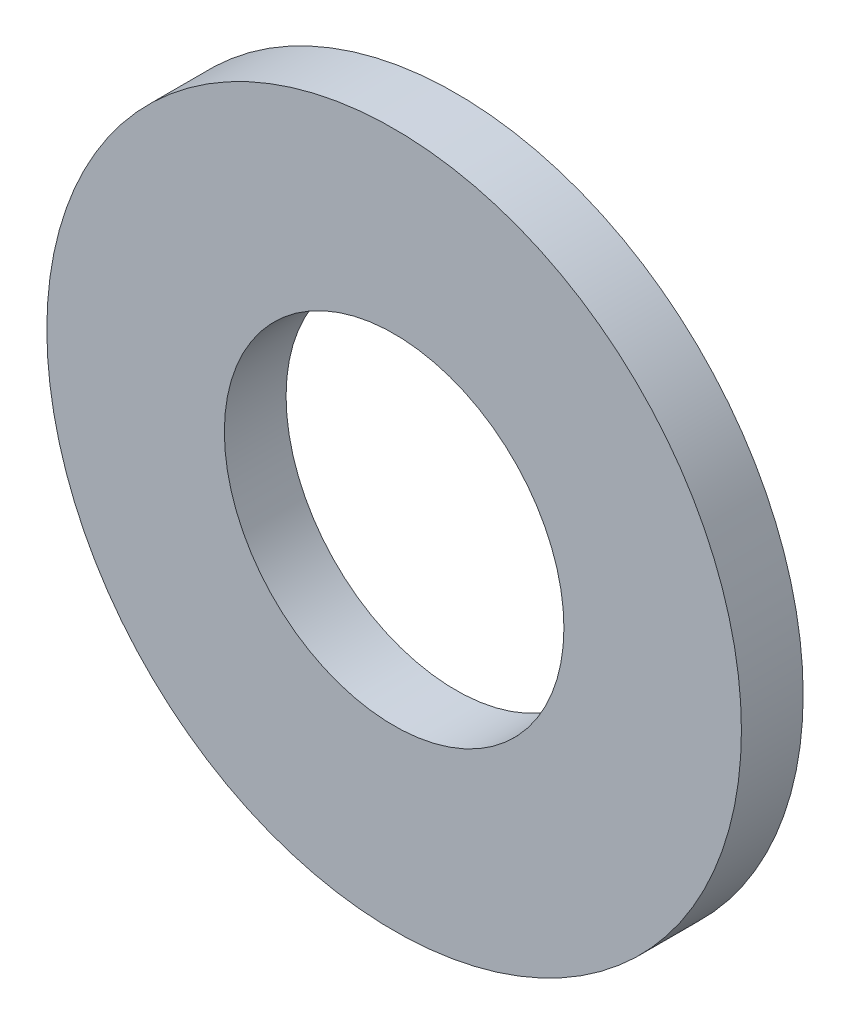
ISO-10303-21;
HEADER;
FILE_DESCRIPTION(('STEP AP214'),'2;1');
FILE_NAME('part.step','',(''),(''),'','','');
FILE_SCHEMA(('AUTOMOTIVE_DESIGN { 1 0 10303 214 1 1 1 1 }'));
ENDSEC;
DATA;
#1=APPLICATION_CONTEXT('core data for automotive mechanical design processes');
#2=APPLICATION_PROTOCOL_DEFINITION('international standard','automotive_design',2000,#1);
#3=PRODUCT_CONTEXT('',#1,'mechanical');
#4=PRODUCT('Part','Part','',(#3));
#5=PRODUCT_RELATED_PRODUCT_CATEGORY('part','',(#4));
#6=PRODUCT_DEFINITION_FORMATION('','',#4);
#7=PRODUCT_DEFINITION_CONTEXT('part definition',#1,'design');
#8=PRODUCT_DEFINITION('design','',#6,#7);
#9=PRODUCT_DEFINITION_SHAPE('','',#8);
#10=(LENGTH_UNIT() NAMED_UNIT(*) SI_UNIT(.MILLI.,.METRE.));
#11=(NAMED_UNIT(*) PLANE_ANGLE_UNIT() SI_UNIT($,.RADIAN.));
#12=(NAMED_UNIT(*) SI_UNIT($,.STERADIAN.) SOLID_ANGLE_UNIT());
#13=UNCERTAINTY_MEASURE_WITH_UNIT(LENGTH_MEASURE(1.E-05),#10,'distance_accuracy_value','');
#14=(GEOMETRIC_REPRESENTATION_CONTEXT(3) GLOBAL_UNCERTAINTY_ASSIGNED_CONTEXT((#13)) GLOBAL_UNIT_ASSIGNED_CONTEXT((#10,
#11,#12)) REPRESENTATION_CONTEXT('',''));
#15=CARTESIAN_POINT('',(0.,0.,0.));
#16=DIRECTION('',(0.,0.,1.));
#17=DIRECTION('',(1.,0.,0.));
#18=AXIS2_PLACEMENT_3D('',#15,#16,#17);
#19=CARTESIAN_POINT('',(0.,0.,0.4));
#20=DIRECTION('',(0.,0.,1.));
#21=DIRECTION('',(1.,0.,0.));
#22=AXIS2_PLACEMENT_3D('',#19,#20,#21);
#23=PLANE('',#22);
#24=CARTESIAN_POINT('',(0.,0.,0.4));
#25=DIRECTION('',(0.,0.,1.));
#26=DIRECTION('',(1.,0.,0.));
#27=AXIS2_PLACEMENT_3D('',#24,#25,#26);
#28=CIRCLE('',#27,2.25);
#29=CARTESIAN_POINT('',(2.25,0.,0.4));
#30=VERTEX_POINT('',#29);
#31=EDGE_CURVE('E10',#30,#30,#28,.T.);
#32=ORIENTED_EDGE('',*,*,#31,.T.);
#33=EDGE_LOOP('',(#32));
#34=FACE_BOUND('',#33,.T.);
#35=CARTESIAN_POINT('',(0.,0.,0.4));
#36=DIRECTION('',(0.,0.,1.));
#37=DIRECTION('',(1.,0.,0.));
#38=AXIS2_PLACEMENT_3D('',#35,#36,#37);
#39=CIRCLE('',#38,1.1);
#40=CARTESIAN_POINT('',(1.1,0.,0.4));
#41=VERTEX_POINT('',#40);
#42=EDGE_CURVE('E43',#41,#41,#39,.T.);
#43=ORIENTED_EDGE('',*,*,#42,.F.);
#44=EDGE_LOOP('',(#43));
#45=FACE_BOUND('',#44,.T.);
#46=ADVANCED_FACE('F32',(#34,#45),#23,.T.);
#47=CARTESIAN_POINT('',(0.,0.,0.));
#48=DIRECTION('',(0.,0.,1.));
#49=DIRECTION('',(1.,0.,0.));
#50=AXIS2_PLACEMENT_3D('',#47,#48,#49);
#51=PLANE('',#50);
#52=CARTESIAN_POINT('',(0.,0.,0.));
#53=DIRECTION('',(0.,0.,1.));
#54=DIRECTION('',(1.,0.,0.));
#55=AXIS2_PLACEMENT_3D('',#52,#53,#54);
#56=CIRCLE('',#55,2.25);
#57=CARTESIAN_POINT('',(2.25,0.,0.));
#58=VERTEX_POINT('',#57);
#59=EDGE_CURVE('E36',#58,#58,#56,.T.);
#60=ORIENTED_EDGE('',*,*,#59,.F.);
#61=EDGE_LOOP('',(#60));
#62=FACE_BOUND('',#61,.T.);
#63=CARTESIAN_POINT('',(0.,0.,0.));
#64=DIRECTION('',(0.,0.,1.));
#65=DIRECTION('',(1.,0.,0.));
#66=AXIS2_PLACEMENT_3D('',#63,#64,#65);
#67=CIRCLE('',#66,1.1);
#68=CARTESIAN_POINT('',(1.1,0.,0.));
#69=VERTEX_POINT('',#68);
#70=EDGE_CURVE('E45',#69,#69,#67,.T.);
#71=ORIENTED_EDGE('',*,*,#70,.T.);
#72=EDGE_LOOP('',(#71));
#73=FACE_BOUND('',#72,.T.);
#74=ADVANCED_FACE('F55',(#62,#73),#51,.F.);
#75=CARTESIAN_POINT('',(0.,0.,0.4));
#76=DIRECTION('',(0.,0.,-1.));
#77=DIRECTION('',(-1.,0.,0.));
#78=AXIS2_PLACEMENT_3D('',#75,#76,#77);
#79=CYLINDRICAL_SURFACE('',#78,2.25);
#80=ORIENTED_EDGE('',*,*,#31,.F.);
#81=EDGE_LOOP('',(#80));
#82=FACE_BOUND('',#81,.T.);
#83=ORIENTED_EDGE('',*,*,#59,.T.);
#84=EDGE_LOOP('',(#83));
#85=FACE_BOUND('',#84,.T.);
#86=ADVANCED_FACE('F34',(#82,#85),#79,.T.);
#87=CARTESIAN_POINT('',(0.,0.,0.4));
#88=DIRECTION('',(0.,0.,-1.));
#89=DIRECTION('',(-1.,0.,0.));
#90=AXIS2_PLACEMENT_3D('',#87,#88,#89);
#91=CYLINDRICAL_SURFACE('',#90,1.1);
#92=ORIENTED_EDGE('',*,*,#42,.T.);
#93=EDGE_LOOP('',(#92));
#94=FACE_BOUND('',#93,.T.);
#95=ORIENTED_EDGE('',*,*,#70,.F.);
#96=EDGE_LOOP('',(#95));
#97=FACE_BOUND('',#96,.T.);
#98=ADVANCED_FACE('F51',(#94,#97),#91,.F.);
#99=CLOSED_SHELL('',(#46,#74,#86,#98));
#100=MANIFOLD_SOLID_BREP('B2',#99);
#101=ADVANCED_BREP_SHAPE_REPRESENTATION('',(#18,#100),#14);
#102=SHAPE_DEFINITION_REPRESENTATION(#9,#101);
ENDSEC;
END-ISO-10303-21;
